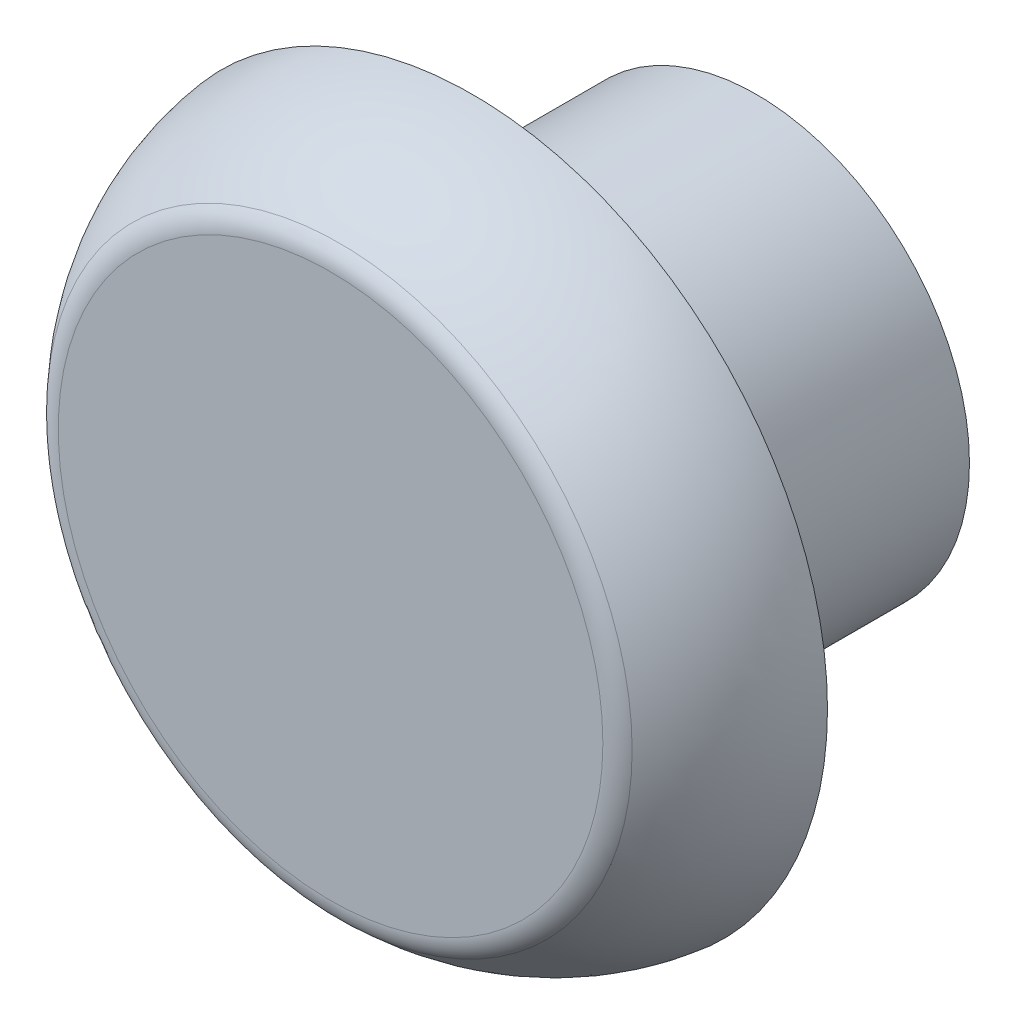
ISO-10303-21;
HEADER;
FILE_DESCRIPTION(('STEP AP214'),'2;1');
FILE_NAME('part.step','',(''),(''),'','','');
FILE_SCHEMA(('AUTOMOTIVE_DESIGN { 1 0 10303 214 1 1 1 1 }'));
ENDSEC;
DATA;
#1=APPLICATION_CONTEXT('core data for automotive mechanical design processes');
#2=APPLICATION_PROTOCOL_DEFINITION('international standard','automotive_design',2000,#1);
#3=PRODUCT_CONTEXT('',#1,'mechanical');
#4=PRODUCT('Part','Part','',(#3));
#5=PRODUCT_RELATED_PRODUCT_CATEGORY('part','',(#4));
#6=PRODUCT_DEFINITION_FORMATION('','',#4);
#7=PRODUCT_DEFINITION_CONTEXT('part definition',#1,'design');
#8=PRODUCT_DEFINITION('design','',#6,#7);
#9=PRODUCT_DEFINITION_SHAPE('','',#8);
#10=(LENGTH_UNIT() NAMED_UNIT(*) SI_UNIT(.MILLI.,.METRE.));
#11=(NAMED_UNIT(*) PLANE_ANGLE_UNIT() SI_UNIT($,.RADIAN.));
#12=(NAMED_UNIT(*) SI_UNIT($,.STERADIAN.) SOLID_ANGLE_UNIT());
#13=UNCERTAINTY_MEASURE_WITH_UNIT(LENGTH_MEASURE(1.E-05),#10,'distance_accuracy_value','');
#14=(GEOMETRIC_REPRESENTATION_CONTEXT(3) GLOBAL_UNCERTAINTY_ASSIGNED_CONTEXT((#13)) GLOBAL_UNIT_ASSIGNED_CONTEXT((#10,
#11,#12)) REPRESENTATION_CONTEXT('',''));
#15=CARTESIAN_POINT('',(0.,0.,0.));
#16=DIRECTION('',(0.,0.,1.));
#17=DIRECTION('',(1.,0.,0.));
#18=AXIS2_PLACEMENT_3D('',#15,#16,#17);
#19=CARTESIAN_POINT('',(0.,0.,2.));
#20=DIRECTION('',(0.,0.,-1.));
#21=DIRECTION('',(-1.,0.,0.));
#22=AXIS2_PLACEMENT_3D('',#19,#20,#21);
#23=CYLINDRICAL_SURFACE('',#22,1.5);
#24=CARTESIAN_POINT('',(0.,0.,2.));
#25=DIRECTION('',(0.,0.,1.));
#26=DIRECTION('',(1.,0.,0.));
#27=AXIS2_PLACEMENT_3D('',#24,#25,#26);
#28=CIRCLE('',#27,1.5);
#29=CARTESIAN_POINT('',(1.5,0.,2.));
#30=VERTEX_POINT('',#29);
#31=EDGE_CURVE('E48',#30,#30,#28,.T.);
#32=ORIENTED_EDGE('',*,*,#31,.F.);
#33=EDGE_LOOP('',(#32));
#34=FACE_BOUND('',#33,.T.);
#35=CARTESIAN_POINT('',(0.,0.,0.));
#36=DIRECTION('',(0.,0.,1.));
#37=DIRECTION('',(1.,0.,0.));
#38=AXIS2_PLACEMENT_3D('',#35,#36,#37);
#39=CIRCLE('',#38,1.5);
#40=CARTESIAN_POINT('',(1.5,0.,0.));
#41=VERTEX_POINT('',#40);
#42=EDGE_CURVE('E52',#41,#41,#39,.T.);
#43=ORIENTED_EDGE('',*,*,#42,.T.);
#44=EDGE_LOOP('',(#43));
#45=FACE_BOUND('',#44,.T.);
#46=ADVANCED_FACE('F37',(#34,#45),#23,.T.);
#47=CARTESIAN_POINT('',(0.,0.,0.));
#48=DIRECTION('',(0.,0.,1.));
#49=DIRECTION('',(1.,0.,0.));
#50=AXIS2_PLACEMENT_3D('',#47,#48,#49);
#51=PLANE('',#50);
#52=ORIENTED_EDGE('',*,*,#42,.F.);
#53=EDGE_LOOP('',(#52));
#54=FACE_BOUND('',#53,.T.);
#55=ADVANCED_FACE('F72',(#54),#51,.F.);
#56=CARTESIAN_POINT('',(0.,0.,2.));
#57=DIRECTION('',(0.,0.,1.));
#58=DIRECTION('',(1.,0.,0.));
#59=AXIS2_PLACEMENT_3D('',#56,#57,#58);
#60=PLANE('',#59);
#61=ORIENTED_EDGE('',*,*,#31,.T.);
#62=EDGE_LOOP('',(#61));
#63=FACE_BOUND('',#62,.T.);
#64=CARTESIAN_POINT('',(0.,0.,2.));
#65=DIRECTION('',(0.,0.,-1.));
#66=DIRECTION('',(-1.,0.,0.));
#67=AXIS2_PLACEMENT_3D('',#64,#65,#66);
#68=CIRCLE('',#67,2.5);
#69=CARTESIAN_POINT('',(-2.5,0.,2.));
#70=VERTEX_POINT('',#69);
#71=EDGE_CURVE('E56',#70,#70,#68,.T.);
#72=ORIENTED_EDGE('',*,*,#71,.T.);
#73=EDGE_LOOP('',(#72));
#74=FACE_BOUND('',#73,.T.);
#75=ADVANCED_FACE('F61',(#63,#74),#60,.F.);
#76=CARTESIAN_POINT('',(0.,0.,1.82414904197004));
#77=DIRECTION('',(0.,0.,-1.));
#78=DIRECTION('',(-1.,0.,0.));
#79=AXIS2_PLACEMENT_3D('',#76,#77,#78);
#80=DEGENERATE_TOROIDAL_SURFACE('',#79,0.898298083940089,1.61132634414945,.T.);
#81=CARTESIAN_POINT('',(0.,0.,2.93828849182548));
#82=DIRECTION('',(0.,0.,-1.));
#83=DIRECTION('',(-1.,0.,0.));
#84=AXIS2_PLACEMENT_3D('',#81,#82,#83);
#85=CIRCLE('',#84,2.0623710514236);
#86=CARTESIAN_POINT('',(-2.0623710514236,0.,2.93828849182548));
#87=VERTEX_POINT('',#86);
#88=EDGE_CURVE('E44',#87,#87,#85,.T.);
#89=ORIENTED_EDGE('',*,*,#88,.T.);
#90=EDGE_LOOP('',(#89));
#91=FACE_BOUND('',#90,.T.);
#92=ORIENTED_EDGE('',*,*,#71,.F.);
#93=EDGE_LOOP('',(#92));
#94=FACE_BOUND('',#93,.T.);
#95=ADVANCED_FACE('F63',(#91,#94),#80,.T.);
#96=CARTESIAN_POINT('',(0.,0.,3.));
#97=DIRECTION('',(0.,0.,1.));
#98=DIRECTION('',(1.,0.,0.));
#99=AXIS2_PLACEMENT_3D('',#96,#97,#98);
#100=PLANE('',#99);
#101=CARTESIAN_POINT('',(0.,0.,3.));
#102=DIRECTION('',(0.,0.,1.));
#103=DIRECTION('',(1.,0.,0.));
#104=AXIS2_PLACEMENT_3D('',#101,#102,#103);
#105=CIRCLE('',#104,1.91788474401479);
#106=CARTESIAN_POINT('',(1.91788474401479,0.,3.));
#107=VERTEX_POINT('',#106);
#108=EDGE_CURVE('E10',#107,#107,#105,.T.);
#109=ORIENTED_EDGE('',*,*,#108,.T.);
#110=EDGE_LOOP('',(#109));
#111=FACE_BOUND('',#110,.T.);
#112=ADVANCED_FACE('F65',(#111),#100,.T.);
#113=CARTESIAN_POINT('',(0.,0.,2.8));
#114=DIRECTION('',(0.,0.,1.));
#115=DIRECTION('',(1.,0.,0.));
#116=AXIS2_PLACEMENT_3D('',#113,#114,#115);
#117=TOROIDAL_SURFACE('',#116,1.91788474401479,0.2);
#118=ORIENTED_EDGE('',*,*,#108,.F.);
#119=EDGE_LOOP('',(#118));
#120=FACE_BOUND('',#119,.T.);
#121=ORIENTED_EDGE('',*,*,#88,.F.);
#122=EDGE_LOOP('',(#121));
#123=FACE_BOUND('',#122,.T.);
#124=ADVANCED_FACE('F39',(#120,#123),#117,.T.);
#125=CLOSED_SHELL('',(#46,#55,#75,#95,#112,#124));
#126=MANIFOLD_SOLID_BREP('B2',#125);
#127=ADVANCED_BREP_SHAPE_REPRESENTATION('',(#18,#126),#14);
#128=SHAPE_DEFINITION_REPRESENTATION(#9,#127);
ENDSEC;
END-ISO-10303-21;
